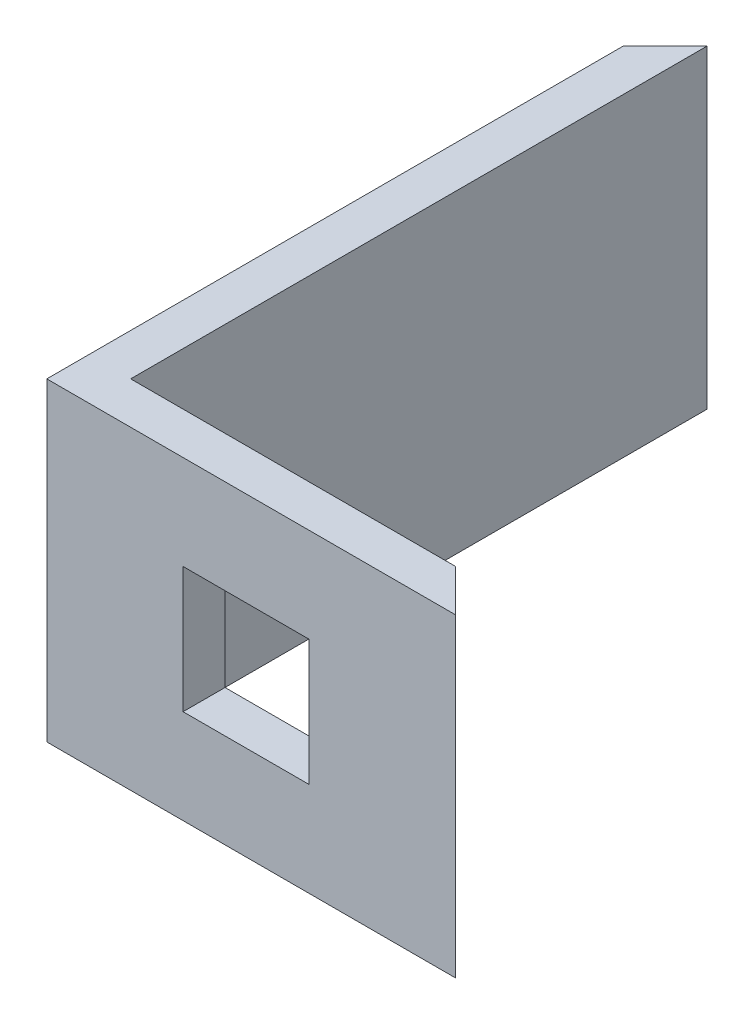
ISO-10303-21;
HEADER;
FILE_DESCRIPTION(('STEP AP214'),'2;1');
FILE_NAME('part.step','',(''),(''),'','','');
FILE_SCHEMA(('AUTOMOTIVE_DESIGN { 1 0 10303 214 1 1 1 1 }'));
ENDSEC;
DATA;
#1=APPLICATION_CONTEXT('core data for automotive mechanical design processes');
#2=APPLICATION_PROTOCOL_DEFINITION('international standard','automotive_design',2000,#1);
#3=PRODUCT_CONTEXT('',#1,'mechanical');
#4=PRODUCT('Part','Part','',(#3));
#5=PRODUCT_RELATED_PRODUCT_CATEGORY('part','',(#4));
#6=PRODUCT_DEFINITION_FORMATION('','',#4);
#7=PRODUCT_DEFINITION_CONTEXT('part definition',#1,'design');
#8=PRODUCT_DEFINITION('design','',#6,#7);
#9=PRODUCT_DEFINITION_SHAPE('','',#8);
#10=(LENGTH_UNIT() NAMED_UNIT(*) SI_UNIT(.MILLI.,.METRE.));
#11=(NAMED_UNIT(*) PLANE_ANGLE_UNIT() SI_UNIT($,.RADIAN.));
#12=(NAMED_UNIT(*) SI_UNIT($,.STERADIAN.) SOLID_ANGLE_UNIT());
#13=UNCERTAINTY_MEASURE_WITH_UNIT(LENGTH_MEASURE(1.E-05),#10,'distance_accuracy_value','');
#14=(GEOMETRIC_REPRESENTATION_CONTEXT(3) GLOBAL_UNCERTAINTY_ASSIGNED_CONTEXT((#13)) GLOBAL_UNIT_ASSIGNED_CONTEXT((#10,
#11,#12)) REPRESENTATION_CONTEXT('',''));
#15=CARTESIAN_POINT('',(0.,0.,0.));
#16=DIRECTION('',(0.,0.,1.));
#17=DIRECTION('',(1.,0.,0.));
#18=AXIS2_PLACEMENT_3D('',#15,#16,#17);
#19=CARTESIAN_POINT('',(0.,15.,-27.5));
#20=DIRECTION('',(0.707106781186552,0.,0.707106781186544));
#21=DIRECTION('',(0.707106781186544,0.,-0.707106781186552));
#22=AXIS2_PLACEMENT_3D('',#19,#20,#21);
#23=PLANE('',#22);
#24=DIRECTION('',(-0.707106781186544,0.,0.707106781186552));
#25=VECTOR('',#24,1.);
#26=CARTESIAN_POINT('',(0.,0.,-27.5));
#27=LINE('',#26,#25);
#28=CARTESIAN_POINT('',(0.,0.,-27.5));
#29=VERTEX_POINT('',#28);
#30=CARTESIAN_POINT('',(-2.,0.,-25.5));
#31=VERTEX_POINT('',#30);
#32=EDGE_CURVE('E135',#29,#31,#27,.T.);
#33=ORIENTED_EDGE('',*,*,#32,.T.);
#34=DIRECTION('',(0.,-1.,0.));
#35=VECTOR('',#34,1.);
#36=CARTESIAN_POINT('',(-2.,15.,-25.5));
#37=LINE('',#36,#35);
#38=CARTESIAN_POINT('',(-2.,15.,-25.5));
#39=VERTEX_POINT('',#38);
#40=EDGE_CURVE('E178',#39,#31,#37,.T.);
#41=ORIENTED_EDGE('',*,*,#40,.F.);
#42=DIRECTION('',(-0.707106781186544,0.,0.707106781186552));
#43=VECTOR('',#42,1.);
#44=CARTESIAN_POINT('',(0.,15.,-27.5));
#45=LINE('',#44,#43);
#46=CARTESIAN_POINT('',(0.,15.,-27.5));
#47=VERTEX_POINT('',#46);
#48=EDGE_CURVE('E138',#47,#39,#45,.T.);
#49=ORIENTED_EDGE('',*,*,#48,.F.);
#50=DIRECTION('',(0.,-1.,0.));
#51=VECTOR('',#50,1.);
#52=CARTESIAN_POINT('',(0.,15.,-27.5));
#53=LINE('',#52,#51);
#54=EDGE_CURVE('E152',#47,#29,#53,.T.);
#55=ORIENTED_EDGE('',*,*,#54,.T.);
#56=EDGE_LOOP('',(#33,#41,#49,#55));
#57=FACE_BOUND('',#56,.T.);
#58=ADVANCED_FACE('F33',(#57),#23,.F.);
#59=CARTESIAN_POINT('',(-2.,15.,-25.5));
#60=DIRECTION('',(1.,0.,0.));
#61=DIRECTION('',(0.,0.,-1.));
#62=AXIS2_PLACEMENT_3D('',#59,#60,#61);
#63=PLANE('',#62);
#64=DIRECTION('',(0.,0.,1.));
#65=VECTOR('',#64,1.);
#66=CARTESIAN_POINT('',(-2.,0.,-25.5));
#67=LINE('',#66,#65);
#68=CARTESIAN_POINT('',(-2.,0.,2.));
#69=VERTEX_POINT('',#68);
#70=EDGE_CURVE('E155',#31,#69,#67,.T.);
#71=ORIENTED_EDGE('',*,*,#70,.T.);
#72=DIRECTION('',(0.,-1.,0.));
#73=VECTOR('',#72,1.);
#74=CARTESIAN_POINT('',(-2.,15.,2.));
#75=LINE('',#74,#73);
#76=CARTESIAN_POINT('',(-2.,15.,2.));
#77=VERTEX_POINT('',#76);
#78=EDGE_CURVE('E175',#77,#69,#75,.T.);
#79=ORIENTED_EDGE('',*,*,#78,.F.);
#80=DIRECTION('',(0.,0.,1.));
#81=VECTOR('',#80,1.);
#82=CARTESIAN_POINT('',(-2.,15.,-25.5));
#83=LINE('',#82,#81);
#84=EDGE_CURVE('E141',#39,#77,#83,.T.);
#85=ORIENTED_EDGE('',*,*,#84,.F.);
#86=ORIENTED_EDGE('',*,*,#40,.T.);
#87=EDGE_LOOP('',(#71,#79,#85,#86));
#88=FACE_BOUND('',#87,.T.);
#89=ADVANCED_FACE('F205',(#88),#63,.F.);
#90=CARTESIAN_POINT('',(-2.,15.,2.));
#91=DIRECTION('',(0.,0.,-1.));
#92=DIRECTION('',(-1.,0.,0.));
#93=AXIS2_PLACEMENT_3D('',#90,#91,#92);
#94=PLANE('',#93);
#95=DIRECTION('',(1.,0.,0.));
#96=VECTOR('',#95,1.);
#97=CARTESIAN_POINT('',(4.5,4.5,2.));
#98=LINE('',#97,#96);
#99=CARTESIAN_POINT('',(4.5,4.5,2.));
#100=VERTEX_POINT('',#99);
#101=CARTESIAN_POINT('',(10.5,4.5,2.));
#102=VERTEX_POINT('',#101);
#103=EDGE_CURVE('E121',#100,#102,#98,.T.);
#104=ORIENTED_EDGE('',*,*,#103,.F.);
#105=DIRECTION('',(0.,-1.,0.));
#106=VECTOR('',#105,1.);
#107=CARTESIAN_POINT('',(4.5,10.5,2.));
#108=LINE('',#107,#106);
#109=CARTESIAN_POINT('',(4.5,10.5,2.));
#110=VERTEX_POINT('',#109);
#111=EDGE_CURVE('E47',#110,#100,#108,.T.);
#112=ORIENTED_EDGE('',*,*,#111,.F.);
#113=DIRECTION('',(-1.,0.,0.));
#114=VECTOR('',#113,1.);
#115=CARTESIAN_POINT('',(4.5,10.5,2.));
#116=LINE('',#115,#114);
#117=CARTESIAN_POINT('',(10.5,10.5,2.));
#118=VERTEX_POINT('',#117);
#119=EDGE_CURVE('E128',#118,#110,#116,.T.);
#120=ORIENTED_EDGE('',*,*,#119,.F.);
#121=DIRECTION('',(0.,1.,0.));
#122=VECTOR('',#121,1.);
#123=CARTESIAN_POINT('',(10.5,10.5,2.));
#124=LINE('',#123,#122);
#125=EDGE_CURVE('E112',#102,#118,#124,.T.);
#126=ORIENTED_EDGE('',*,*,#125,.F.);
#127=EDGE_LOOP('',(#104,#112,#120,#126));
#128=FACE_BOUND('',#127,.T.);
#129=DIRECTION('',(1.,0.,0.));
#130=VECTOR('',#129,1.);
#131=CARTESIAN_POINT('',(-2.,0.,2.));
#132=LINE('',#131,#130);
#133=CARTESIAN_POINT('',(17.5,0.,2.));
#134=VERTEX_POINT('',#133);
#135=EDGE_CURVE('E157',#69,#134,#132,.T.);
#136=ORIENTED_EDGE('',*,*,#135,.T.);
#137=DIRECTION('',(0.,-1.,0.));
#138=VECTOR('',#137,1.);
#139=CARTESIAN_POINT('',(17.5,15.,2.));
#140=LINE('',#139,#138);
#141=CARTESIAN_POINT('',(17.5,15.,2.));
#142=VERTEX_POINT('',#141);
#143=EDGE_CURVE('E172',#142,#134,#140,.T.);
#144=ORIENTED_EDGE('',*,*,#143,.F.);
#145=DIRECTION('',(1.,0.,0.));
#146=VECTOR('',#145,1.);
#147=CARTESIAN_POINT('',(-2.,15.,2.));
#148=LINE('',#147,#146);
#149=EDGE_CURVE('E144',#77,#142,#148,.T.);
#150=ORIENTED_EDGE('',*,*,#149,.F.);
#151=ORIENTED_EDGE('',*,*,#78,.T.);
#152=EDGE_LOOP('',(#136,#144,#150,#151));
#153=FACE_BOUND('',#152,.T.);
#154=ADVANCED_FACE('F125',(#128,#153),#94,.F.);
#155=CARTESIAN_POINT('',(17.5,15.,2.));
#156=DIRECTION('',(-0.707106781186547,0.,0.707106781186547));
#157=DIRECTION('',(0.707106781186548,0.,0.707106781186548));
#158=AXIS2_PLACEMENT_3D('',#155,#156,#157);
#159=PLANE('',#158);
#160=DIRECTION('',(-0.707106781186547,0.,-0.707106781186547));
#161=VECTOR('',#160,1.);
#162=CARTESIAN_POINT('',(17.5,0.,2.));
#163=LINE('',#162,#161);
#164=CARTESIAN_POINT('',(15.5,0.,0.));
#165=VERTEX_POINT('',#164);
#166=EDGE_CURVE('E159',#134,#165,#163,.T.);
#167=ORIENTED_EDGE('',*,*,#166,.T.);
#168=DIRECTION('',(0.,-1.,0.));
#169=VECTOR('',#168,1.);
#170=CARTESIAN_POINT('',(15.5,15.,0.));
#171=LINE('',#170,#169);
#172=CARTESIAN_POINT('',(15.5,15.,0.));
#173=VERTEX_POINT('',#172);
#174=EDGE_CURVE('E169',#173,#165,#171,.T.);
#175=ORIENTED_EDGE('',*,*,#174,.F.);
#176=DIRECTION('',(-0.707106781186547,0.,-0.707106781186547));
#177=VECTOR('',#176,1.);
#178=CARTESIAN_POINT('',(17.5,15.,2.));
#179=LINE('',#178,#177);
#180=EDGE_CURVE('E146',#142,#173,#179,.T.);
#181=ORIENTED_EDGE('',*,*,#180,.F.);
#182=ORIENTED_EDGE('',*,*,#143,.T.);
#183=EDGE_LOOP('',(#167,#175,#181,#182));
#184=FACE_BOUND('',#183,.T.);
#185=ADVANCED_FACE('F229',(#184),#159,.F.);
#186=CARTESIAN_POINT('',(15.5,15.,0.));
#187=DIRECTION('',(0.,0.,1.));
#188=DIRECTION('',(1.,0.,0.));
#189=AXIS2_PLACEMENT_3D('',#186,#187,#188);
#190=PLANE('',#189);
#191=DIRECTION('',(-1.,0.,0.));
#192=VECTOR('',#191,1.);
#193=CARTESIAN_POINT('',(15.5,10.5,0.));
#194=LINE('',#193,#192);
#195=CARTESIAN_POINT('',(10.5,10.5,0.));
#196=VERTEX_POINT('',#195);
#197=CARTESIAN_POINT('',(4.5,10.5,0.));
#198=VERTEX_POINT('',#197);
#199=EDGE_CURVE('E40',#196,#198,#194,.T.);
#200=ORIENTED_EDGE('',*,*,#199,.T.);
#201=DIRECTION('',(0.,-1.,0.));
#202=VECTOR('',#201,1.);
#203=CARTESIAN_POINT('',(4.5,15.,0.));
#204=LINE('',#203,#202);
#205=CARTESIAN_POINT('',(4.5,4.5,0.));
#206=VERTEX_POINT('',#205);
#207=EDGE_CURVE('E11',#198,#206,#204,.T.);
#208=ORIENTED_EDGE('',*,*,#207,.T.);
#209=DIRECTION('',(1.,0.,0.));
#210=VECTOR('',#209,1.);
#211=CARTESIAN_POINT('',(15.5,4.5,0.));
#212=LINE('',#211,#210);
#213=CARTESIAN_POINT('',(10.5,4.5,0.));
#214=VERTEX_POINT('',#213);
#215=EDGE_CURVE('E181',#206,#214,#212,.T.);
#216=ORIENTED_EDGE('',*,*,#215,.T.);
#217=DIRECTION('',(0.,1.,0.));
#218=VECTOR('',#217,1.);
#219=CARTESIAN_POINT('',(10.5,15.,0.));
#220=LINE('',#219,#218);
#221=EDGE_CURVE('E115',#214,#196,#220,.T.);
#222=ORIENTED_EDGE('',*,*,#221,.T.);
#223=EDGE_LOOP('',(#200,#208,#216,#222));
#224=FACE_BOUND('',#223,.T.);
#225=DIRECTION('',(-1.,0.,0.));
#226=VECTOR('',#225,1.);
#227=CARTESIAN_POINT('',(15.5,0.,0.));
#228=LINE('',#227,#226);
#229=CARTESIAN_POINT('',(0.,0.,0.));
#230=VERTEX_POINT('',#229);
#231=EDGE_CURVE('E161',#165,#230,#228,.T.);
#232=ORIENTED_EDGE('',*,*,#231,.T.);
#233=DIRECTION('',(0.,-1.,0.));
#234=VECTOR('',#233,1.);
#235=CARTESIAN_POINT('',(0.,15.,0.));
#236=LINE('',#235,#234);
#237=CARTESIAN_POINT('',(0.,15.,0.));
#238=VERTEX_POINT('',#237);
#239=EDGE_CURVE('E166',#238,#230,#236,.T.);
#240=ORIENTED_EDGE('',*,*,#239,.F.);
#241=DIRECTION('',(-1.,0.,0.));
#242=VECTOR('',#241,1.);
#243=CARTESIAN_POINT('',(15.5,15.,0.));
#244=LINE('',#243,#242);
#245=EDGE_CURVE('E148',#173,#238,#244,.T.);
#246=ORIENTED_EDGE('',*,*,#245,.F.);
#247=ORIENTED_EDGE('',*,*,#174,.T.);
#248=EDGE_LOOP('',(#232,#240,#246,#247));
#249=FACE_BOUND('',#248,.T.);
#250=ADVANCED_FACE('F185',(#224,#249),#190,.F.);
#251=CARTESIAN_POINT('',(0.,15.,0.));
#252=DIRECTION('',(-1.,0.,0.));
#253=DIRECTION('',(0.,0.,1.));
#254=AXIS2_PLACEMENT_3D('',#251,#252,#253);
#255=PLANE('',#254);
#256=DIRECTION('',(0.,0.,-1.));
#257=VECTOR('',#256,1.);
#258=CARTESIAN_POINT('',(0.,0.,0.));
#259=LINE('',#258,#257);
#260=EDGE_CURVE('E142',#230,#29,#259,.T.);
#261=ORIENTED_EDGE('',*,*,#260,.T.);
#262=ORIENTED_EDGE('',*,*,#54,.F.);
#263=DIRECTION('',(0.,0.,-1.));
#264=VECTOR('',#263,1.);
#265=CARTESIAN_POINT('',(0.,15.,0.));
#266=LINE('',#265,#264);
#267=EDGE_CURVE('E150',#238,#47,#266,.T.);
#268=ORIENTED_EDGE('',*,*,#267,.F.);
#269=ORIENTED_EDGE('',*,*,#239,.T.);
#270=EDGE_LOOP('',(#261,#262,#268,#269));
#271=FACE_BOUND('',#270,.T.);
#272=ADVANCED_FACE('F226',(#271),#255,.F.);
#273=CARTESIAN_POINT('',(0.,15.,0.));
#274=DIRECTION('',(0.,-1.,0.));
#275=DIRECTION('',(0.,0.,-1.));
#276=AXIS2_PLACEMENT_3D('',#273,#274,#275);
#277=PLANE('',#276);
#278=ORIENTED_EDGE('',*,*,#48,.T.);
#279=ORIENTED_EDGE('',*,*,#84,.T.);
#280=ORIENTED_EDGE('',*,*,#149,.T.);
#281=ORIENTED_EDGE('',*,*,#180,.T.);
#282=ORIENTED_EDGE('',*,*,#245,.T.);
#283=ORIENTED_EDGE('',*,*,#267,.T.);
#284=EDGE_LOOP('',(#278,#279,#280,#281,#282,#283));
#285=FACE_BOUND('',#284,.T.);
#286=ADVANCED_FACE('F199',(#285),#277,.F.);
#287=CARTESIAN_POINT('',(0.,0.,0.));
#288=DIRECTION('',(0.,-1.,0.));
#289=DIRECTION('',(0.,0.,-1.));
#290=AXIS2_PLACEMENT_3D('',#287,#288,#289);
#291=PLANE('',#290);
#292=ORIENTED_EDGE('',*,*,#32,.F.);
#293=ORIENTED_EDGE('',*,*,#260,.F.);
#294=ORIENTED_EDGE('',*,*,#231,.F.);
#295=ORIENTED_EDGE('',*,*,#166,.F.);
#296=ORIENTED_EDGE('',*,*,#135,.F.);
#297=ORIENTED_EDGE('',*,*,#70,.F.);
#298=EDGE_LOOP('',(#292,#293,#294,#295,#296,#297));
#299=FACE_BOUND('',#298,.T.);
#300=ADVANCED_FACE('F192',(#299),#291,.T.);
#301=CARTESIAN_POINT('',(4.5,10.5,-27.5));
#302=DIRECTION('',(-1.,0.,0.));
#303=DIRECTION('',(0.,-1.,0.));
#304=AXIS2_PLACEMENT_3D('',#301,#302,#303);
#305=PLANE('',#304);
#306=DIRECTION('',(0.,0.,1.));
#307=VECTOR('',#306,1.);
#308=CARTESIAN_POINT('',(4.5,10.5,-27.5));
#309=LINE('',#308,#307);
#310=EDGE_CURVE('E133',#198,#110,#309,.T.);
#311=ORIENTED_EDGE('',*,*,#310,.T.);
#312=ORIENTED_EDGE('',*,*,#111,.T.);
#313=DIRECTION('',(0.,0.,1.));
#314=VECTOR('',#313,1.);
#315=CARTESIAN_POINT('',(4.5,4.5,-27.5));
#316=LINE('',#315,#314);
#317=EDGE_CURVE('E118',#206,#100,#316,.T.);
#318=ORIENTED_EDGE('',*,*,#317,.F.);
#319=ORIENTED_EDGE('',*,*,#207,.F.);
#320=EDGE_LOOP('',(#311,#312,#318,#319));
#321=FACE_BOUND('',#320,.T.);
#322=ADVANCED_FACE('F190',(#321),#305,.F.);
#323=CARTESIAN_POINT('',(4.5,10.5,-27.5));
#324=DIRECTION('',(0.,1.,0.));
#325=DIRECTION('',(0.,0.,1.));
#326=AXIS2_PLACEMENT_3D('',#323,#324,#325);
#327=PLANE('',#326);
#328=DIRECTION('',(0.,0.,1.));
#329=VECTOR('',#328,1.);
#330=CARTESIAN_POINT('',(10.5,10.5,-27.5));
#331=LINE('',#330,#329);
#332=EDGE_CURVE('E117',#196,#118,#331,.T.);
#333=ORIENTED_EDGE('',*,*,#332,.T.);
#334=ORIENTED_EDGE('',*,*,#119,.T.);
#335=ORIENTED_EDGE('',*,*,#310,.F.);
#336=ORIENTED_EDGE('',*,*,#199,.F.);
#337=EDGE_LOOP('',(#333,#334,#335,#336));
#338=FACE_BOUND('',#337,.T.);
#339=ADVANCED_FACE('F189',(#338),#327,.F.);
#340=CARTESIAN_POINT('',(10.5,10.5,-27.5));
#341=DIRECTION('',(1.,0.,0.));
#342=DIRECTION('',(0.,0.,-1.));
#343=AXIS2_PLACEMENT_3D('',#340,#341,#342);
#344=PLANE('',#343);
#345=DIRECTION('',(0.,0.,1.));
#346=VECTOR('',#345,1.);
#347=CARTESIAN_POINT('',(10.5,4.5,-27.5));
#348=LINE('',#347,#346);
#349=EDGE_CURVE('E55',#214,#102,#348,.T.);
#350=ORIENTED_EDGE('',*,*,#349,.T.);
#351=ORIENTED_EDGE('',*,*,#125,.T.);
#352=ORIENTED_EDGE('',*,*,#332,.F.);
#353=ORIENTED_EDGE('',*,*,#221,.F.);
#354=EDGE_LOOP('',(#350,#351,#352,#353));
#355=FACE_BOUND('',#354,.T.);
#356=ADVANCED_FACE('F109',(#355),#344,.F.);
#357=CARTESIAN_POINT('',(4.5,4.5,-27.5));
#358=DIRECTION('',(0.,-1.,0.));
#359=DIRECTION('',(0.,0.,-1.));
#360=AXIS2_PLACEMENT_3D('',#357,#358,#359);
#361=PLANE('',#360);
#362=ORIENTED_EDGE('',*,*,#317,.T.);
#363=ORIENTED_EDGE('',*,*,#103,.T.);
#364=ORIENTED_EDGE('',*,*,#349,.F.);
#365=ORIENTED_EDGE('',*,*,#215,.F.);
#366=EDGE_LOOP('',(#362,#363,#364,#365));
#367=FACE_BOUND('',#366,.T.);
#368=ADVANCED_FACE('F122',(#367),#361,.F.);
#369=CLOSED_SHELL('',(#58,#89,#154,#185,#250,#272,#286,#300,#322,#339,#356,#368));
#370=MANIFOLD_SOLID_BREP('B2',#369);
#371=ADVANCED_BREP_SHAPE_REPRESENTATION('',(#18,#370),#14);
#372=SHAPE_DEFINITION_REPRESENTATION(#9,#371);
ENDSEC;
END-ISO-10303-21;
